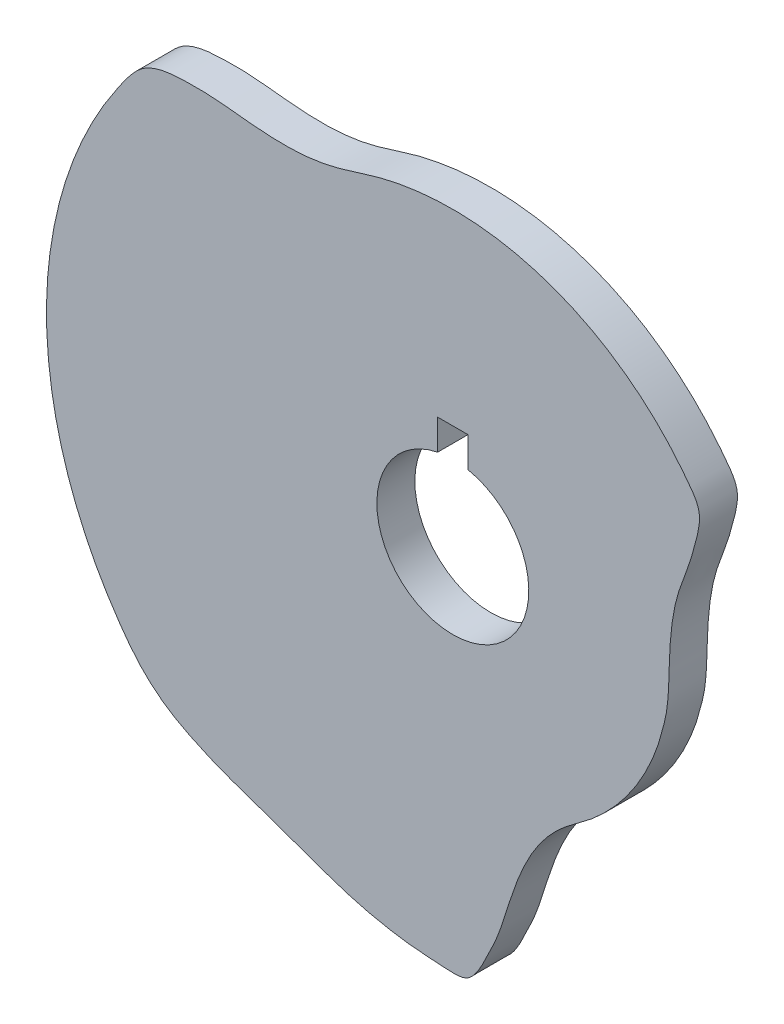
ISO-10303-21;
HEADER;
FILE_DESCRIPTION(('STEP AP214'),'2;1');
FILE_NAME('part.step','',(''),(''),'','','');
FILE_SCHEMA(('AUTOMOTIVE_DESIGN { 1 0 10303 214 1 1 1 1 }'));
ENDSEC;
DATA;
#1=APPLICATION_CONTEXT('core data for automotive mechanical design processes');
#2=APPLICATION_PROTOCOL_DEFINITION('international standard','automotive_design',2000,#1);
#3=PRODUCT_CONTEXT('',#1,'mechanical');
#4=PRODUCT('Part','Part','',(#3));
#5=PRODUCT_RELATED_PRODUCT_CATEGORY('part','',(#4));
#6=PRODUCT_DEFINITION_FORMATION('','',#4);
#7=PRODUCT_DEFINITION_CONTEXT('part definition',#1,'design');
#8=PRODUCT_DEFINITION('design','',#6,#7);
#9=PRODUCT_DEFINITION_SHAPE('','',#8);
#10=(LENGTH_UNIT() NAMED_UNIT(*) SI_UNIT(.MILLI.,.METRE.));
#11=(NAMED_UNIT(*) PLANE_ANGLE_UNIT() SI_UNIT($,.RADIAN.));
#12=(NAMED_UNIT(*) SI_UNIT($,.STERADIAN.) SOLID_ANGLE_UNIT());
#13=UNCERTAINTY_MEASURE_WITH_UNIT(LENGTH_MEASURE(1.E-05),#10,'distance_accuracy_value','');
#14=(GEOMETRIC_REPRESENTATION_CONTEXT(3) GLOBAL_UNCERTAINTY_ASSIGNED_CONTEXT((#13)) GLOBAL_UNIT_ASSIGNED_CONTEXT((#10,
#11,#12)) REPRESENTATION_CONTEXT('',''));
#15=CARTESIAN_POINT('',(0.,0.,0.));
#16=DIRECTION('',(0.,0.,1.));
#17=DIRECTION('',(1.,0.,0.));
#18=AXIS2_PLACEMENT_3D('',#15,#16,#17);
#19=CARTESIAN_POINT('',(0.,0.,0.));
#20=DIRECTION('',(0.,0.,-1.));
#21=DIRECTION('',(-1.,0.,0.));
#22=AXIS2_PLACEMENT_3D('',#19,#20,#21);
#23=PLANE('',#22);
#24=CARTESIAN_POINT('',(0.,0.,0.));
#25=DIRECTION('',(0.,0.,1.));
#26=DIRECTION('',(1.,0.,0.));
#27=AXIS2_PLACEMENT_3D('',#24,#25,#26);
#28=CIRCLE('',#27,20.);
#29=CARTESIAN_POINT('',(-4.,19.5959179422654,0.));
#30=VERTEX_POINT('',#29);
#31=CARTESIAN_POINT('',(4.,19.5959179422654,0.));
#32=VERTEX_POINT('',#31);
#33=EDGE_CURVE('E97',#30,#32,#28,.T.);
#34=ORIENTED_EDGE('',*,*,#33,.T.);
#35=DIRECTION('',(0.,1.,0.));
#36=VECTOR('',#35,1.);
#37=CARTESIAN_POINT('',(4.,27.5959179422654,0.));
#38=LINE('',#37,#36);
#39=CARTESIAN_POINT('',(4.,27.5959179422654,0.));
#40=VERTEX_POINT('',#39);
#41=EDGE_CURVE('E107',#32,#40,#38,.T.);
#42=ORIENTED_EDGE('',*,*,#41,.T.);
#43=DIRECTION('',(-1.,0.,0.));
#44=VECTOR('',#43,1.);
#45=CARTESIAN_POINT('',(-4.,27.5959179422654,0.));
#46=LINE('',#45,#44);
#47=CARTESIAN_POINT('',(-4.,27.5959179422654,0.));
#48=VERTEX_POINT('',#47);
#49=EDGE_CURVE('E69',#40,#48,#46,.T.);
#50=ORIENTED_EDGE('',*,*,#49,.T.);
#51=DIRECTION('',(0.,-1.,0.));
#52=VECTOR('',#51,1.);
#53=CARTESIAN_POINT('',(-4.,19.5959179422654,0.));
#54=LINE('',#53,#52);
#55=EDGE_CURVE('E104',#48,#30,#54,.T.);
#56=ORIENTED_EDGE('',*,*,#55,.T.);
#57=EDGE_LOOP('',(#34,#42,#50,#56));
#58=FACE_BOUND('',#57,.T.);
#59=CARTESIAN_POINT('',(56.932985488465,-0.000795580754406854,0.));
#60=CARTESIAN_POINT('',(57.1265117872127,6.5314537222661,0.));
#61=CARTESIAN_POINT('',(57.628936842633,16.0019031637885,0.));
#62=CARTESIAN_POINT('',(62.030801139415,26.1826523327394,0.));
#63=CARTESIAN_POINT('',(63.5942147590107,31.7068047744134,0.));
#64=CARTESIAN_POINT('',(64.7244718244501,35.9171577105034,0.));
#65=CARTESIAN_POINT('',(65.1715306906432,39.6107541113783,0.));
#66=CARTESIAN_POINT('',(64.2655833240798,42.3562944531799,0.));
#67=CARTESIAN_POINT('',(62.7177696465751,44.8445809892535,0.));
#68=CARTESIAN_POINT('',(60.0039032705138,48.2666530885387,0.));
#69=CARTESIAN_POINT('',(56.7652172552194,52.1574868930675,0.));
#70=CARTESIAN_POINT('',(52.6457166223139,56.2656658483215,0.));
#71=CARTESIAN_POINT('',(48.8371927938718,59.6202696103441,0.));
#72=CARTESIAN_POINT('',(44.2047377694369,63.1243277587699,0.));
#73=CARTESIAN_POINT('',(39.342870195165,66.2985395237317,0.));
#74=CARTESIAN_POINT('',(34.2255475391978,69.0475622426028,0.));
#75=CARTESIAN_POINT('',(28.9315251858536,71.4282271127832,0.));
#76=CARTESIAN_POINT('',(24.1605721111998,73.1797199037561,0.));
#77=CARTESIAN_POINT('',(18.5836604626458,74.7906106105405,0.));
#78=CARTESIAN_POINT('',(13.6136636120437,75.8533075455415,0.));
#79=CARTESIAN_POINT('',(7.86567619338137,76.6616905850528,0.));
#80=CARTESIAN_POINT('',(2.79490028297014,77.0161931006501,0.));
#81=CARTESIAN_POINT('',(-3.00810052431444,77.0017754221471,0.));
#82=CARTESIAN_POINT('',(-8.08183042843877,76.6506128610799,0.));
#83=CARTESIAN_POINT('',(-13.8173173184162,75.7932884332253,0.));
#84=CARTESIAN_POINT('',(-19.5184478852516,74.637220502732,0.));
#85=CARTESIAN_POINT('',(-26.3949902457872,72.318847925541,0.));
#86=CARTESIAN_POINT('',(-34.7729890539926,69.9223070386171,0.));
#87=CARTESIAN_POINT('',(-44.9838015657225,69.1987791316287,0.));
#88=CARTESIAN_POINT('',(-55.0870390824694,70.0786916735431,0.));
#89=CARTESIAN_POINT('',(-63.7521123051776,71.0890902886511,0.));
#90=CARTESIAN_POINT('',(-71.0025604038426,71.0071038532056,0.));
#91=CARTESIAN_POINT('',(-76.8229425776821,70.6195617458742,0.));
#92=CARTESIAN_POINT('',(-81.6102516241114,68.6438192062985,0.));
#93=CARTESIAN_POINT('',(-85.2050472965151,64.9904625074256,0.));
#94=CARTESIAN_POINT('',(-88.4828114308942,60.1897328777169,0.));
#95=CARTESIAN_POINT('',(-92.4413381074632,54.1182826377954,0.));
#96=CARTESIAN_POINT('',(-95.8635555363435,47.706986419514,0.));
#97=CARTESIAN_POINT('',(-99.1666038876376,40.4456158053087,0.));
#98=CARTESIAN_POINT('',(-101.67083906624,33.6280461914854,0.));
#99=CARTESIAN_POINT('',(-103.897432190414,25.9644593884122,0.));
#100=CARTESIAN_POINT('',(-105.415649913043,18.8641709560625,0.));
#101=CARTESIAN_POINT('',(-106.529042283645,10.9603642890687,0.));
#102=CARTESIAN_POINT('',(-107.026301872662,3.7174373137239,0.));
#103=CARTESIAN_POINT('',(-107.006094143672,-4.264828025162,0.));
#104=CARTESIAN_POINT('',(-106.471291558894,-11.5048712183218,0.));
#105=CARTESIAN_POINT('',(-105.318311750108,-19.4034780360237,0.));
#106=CARTESIAN_POINT('',(-103.762276659733,-26.4946784593138,0.));
#107=CARTESIAN_POINT('',(-101.499407274708,-34.1491778675688,0.));
#108=CARTESIAN_POINT('',(-98.9547131041179,-40.949146728792,0.));
#109=CARTESIAN_POINT('',(-95.6254769940491,-48.2026554947876,0.));
#110=CARTESIAN_POINT('',(-92.1484388189359,-54.578006394956,0.));
#111=CARTESIAN_POINT('',(-88.2028166580265,-60.6649016758483,0.));
#112=CARTESIAN_POINT('',(-84.383673705292,-65.9680486906177,0.));
#113=CARTESIAN_POINT('',(-79.956026115792,-70.7867073114572,0.));
#114=CARTESIAN_POINT('',(-74.7450756097247,-74.7706792280249,0.));
#115=CARTESIAN_POINT('',(-68.3491763549446,-78.2095859136178,0.));
#116=CARTESIAN_POINT('',(-61.700090236524,-81.1256631971354,0.));
#117=CARTESIAN_POINT('',(-54.1671376569417,-83.7633032765232,0.));
#118=CARTESIAN_POINT('',(-46.6246464080232,-86.3597264622415,0.));
#119=CARTESIAN_POINT('',(-38.4179019532647,-89.2690596867458,0.));
#120=CARTESIAN_POINT('',(-30.9321348248925,-92.0186188537581,0.));
#121=CARTESIAN_POINT('',(-23.9644549974314,-94.0880842501288,0.));
#122=CARTESIAN_POINT('',(-17.5921379517445,-95.4353648923242,0.));
#123=CARTESIAN_POINT('',(-11.1106765055818,-96.4958633006157,0.));
#124=CARTESIAN_POINT('',(-5.36506695402572,-96.7864859894993,0.));
#125=CARTESIAN_POINT('',(-0.2401939688309,-97.216006130729,0.));
#126=CARTESIAN_POINT('',(3.48152725490005,-97.0141722501915,0.));
#127=CARTESIAN_POINT('',(6.585949682994,-93.8819176237377,0.));
#128=CARTESIAN_POINT('',(8.86961266351349,-89.1721051747951,0.));
#129=CARTESIAN_POINT('',(12.0284425670296,-82.752455701177,0.));
#130=CARTESIAN_POINT('',(14.6079307279909,-74.3591082557124,0.));
#131=CARTESIAN_POINT('',(17.803889194673,-64.7575683881964,0.));
#132=CARTESIAN_POINT('',(22.7225338034349,-55.7585630029658,0.));
#133=CARTESIAN_POINT('',(28.7686732016411,-49.4111901166388,0.));
#134=CARTESIAN_POINT('',(34.1709124303925,-45.7136608546231,0.));
#135=CARTESIAN_POINT('',(38.0914855914377,-42.4881304721686,0.));
#136=CARTESIAN_POINT('',(41.2152414952405,-39.4494197497093,0.));
#137=CARTESIAN_POINT('',(44.1070014657475,-36.1942858828279,0.));
#138=CARTESIAN_POINT('',(46.737794890336,-32.7232692716914,0.));
#139=CARTESIAN_POINT('',(49.1002313365385,-29.0630605339127,0.));
#140=CARTESIAN_POINT('',(51.1682663388948,-25.2332461550136,0.));
#141=CARTESIAN_POINT('',(52.9536691475295,-21.2562132990754,0.));
#142=CARTESIAN_POINT('',(54.1800752040546,-17.8388748323473,0.));
#143=CARTESIAN_POINT('',(55.1237608704029,-14.3604886758475,0.));
#144=CARTESIAN_POINT('',(56.7416260422024,-8.69999774622029,0.));
#145=CARTESIAN_POINT('',(56.8254708780496,-3.62982297132136,0.));
#146=CARTESIAN_POINT('',(56.932985488465,-0.000795580754406854,0.));
#147=B_SPLINE_CURVE_WITH_KNOTS('',3,(#59,#60,#61,#62,#63,#64,#65,#66,#67,#68,#69,#70,#71,#72,
#73,#74,#75,#76,#77,#78,#79,#80,#81,#82,#83,#84,#85,#86,#87,#88,#89,#90,#91,#92,#93,#94,#95,#96,
#97,#98,#99,#100,#101,#102,#103,#104,#105,#106,#107,#108,#109,#110,#111,#112,#113,#114,#115,
#116,#117,#118,#119,#120,#121,#122,#123,#124,#125,#126,#127,#128,#129,#130,#131,#132,#133,#134,
#135,#136,#137,#138,#139,#140,#141,#142,#143,#144,#145,#146),.UNSPECIFIED.,.T.,.F.,(4,1,1,1,1,1,
1,1,1,1,1,1,1,1,1,1,1,1,1,1,1,1,1,1,1,1,1,1,1,1,1,1,1,1,1,1,1,1,1,1,1,1,1,1,1,1,1,1,1,1,1,1,1,1,
1,1,1,1,1,1,1,1,1,1,1,1,1,1,1,1,1,1,1,1,1,1,1,1,1,1,1,1,1,1,1,4),(0.,0.03515625,0.05078125,
0.05859375,0.06640625,0.07421875,0.078125,0.0820312499999948,0.08984375,0.1015625,0.109375,
0.12109375,0.12890625,0.140625,0.15234375,0.16015625,0.171875,0.1796875,0.19140625,0.19921875,
0.2109375,0.21875,0.23046875,0.23828125,0.249999999999999,0.261718750000002,0.27734375,
0.296874999999996,0.31640625,0.33203125,0.34375,0.35546875,0.363281249999999,0.37109375,
0.3828125,0.39453125,0.41015625,0.421875,0.4375,0.44921875,0.46484375,0.4765625,0.4921875,
0.50390625,0.51953125,0.53125,0.546875,0.55859375,0.57421875,0.5859375,0.60156249999999,
0.613281250000007,0.625,0.63671875,0.6484375,0.66015625,0.675781249999998,0.6875,0.703125,
0.71875,0.734375,0.74609375,0.757812500000002,0.76953125,0.781250000000001,0.7890625,0.796875,
0.800781249999999,0.812499999999998,0.824218750000008,0.83984375,0.859375,0.87890625,0.89453125,
0.906249999999974,0.9140625,0.921875,0.9296875,0.9375,0.9453125,0.953125,0.9609375,0.96875,
0.97265625,0.98046875,1.),.UNSPECIFIED.);
#148=CARTESIAN_POINT('',(56.932985488465,-0.000795580754406854,0.));
#149=VERTEX_POINT('',#148);
#150=EDGE_CURVE('E62',#149,#149,#147,.T.);
#151=ORIENTED_EDGE('',*,*,#150,.F.);
#152=EDGE_LOOP('',(#151));
#153=FACE_BOUND('',#152,.T.);
#154=ADVANCED_FACE('F52',(#58,#153),#23,.T.);
#155=CARTESIAN_POINT('',(0.,0.,10.));
#156=DIRECTION('',(0.,0.,-1.));
#157=DIRECTION('',(-1.,0.,0.));
#158=AXIS2_PLACEMENT_3D('',#155,#156,#157);
#159=PLANE('',#158);
#160=DIRECTION('',(0.,1.,0.));
#161=VECTOR('',#160,1.);
#162=CARTESIAN_POINT('',(4.,27.5959179422654,10.));
#163=LINE('',#162,#161);
#164=CARTESIAN_POINT('',(4.,19.5959179422654,10.));
#165=VERTEX_POINT('',#164);
#166=CARTESIAN_POINT('',(4.,27.5959179422654,10.));
#167=VERTEX_POINT('',#166);
#168=EDGE_CURVE('E128',#165,#167,#163,.T.);
#169=ORIENTED_EDGE('',*,*,#168,.F.);
#170=CARTESIAN_POINT('',(0.,0.,10.));
#171=DIRECTION('',(0.,0.,1.));
#172=DIRECTION('',(1.,0.,0.));
#173=AXIS2_PLACEMENT_3D('',#170,#171,#172);
#174=CIRCLE('',#173,20.);
#175=CARTESIAN_POINT('',(-4.,19.5959179422654,10.));
#176=VERTEX_POINT('',#175);
#177=EDGE_CURVE('E77',#176,#165,#174,.T.);
#178=ORIENTED_EDGE('',*,*,#177,.F.);
#179=DIRECTION('',(0.,-1.,0.));
#180=VECTOR('',#179,1.);
#181=CARTESIAN_POINT('',(-4.,19.5959179422654,10.));
#182=LINE('',#181,#180);
#183=CARTESIAN_POINT('',(-4.,27.5959179422654,10.));
#184=VERTEX_POINT('',#183);
#185=EDGE_CURVE('E115',#184,#176,#182,.T.);
#186=ORIENTED_EDGE('',*,*,#185,.F.);
#187=DIRECTION('',(-1.,0.,0.));
#188=VECTOR('',#187,1.);
#189=CARTESIAN_POINT('',(-4.,27.5959179422654,10.));
#190=LINE('',#189,#188);
#191=EDGE_CURVE('E119',#167,#184,#190,.T.);
#192=ORIENTED_EDGE('',*,*,#191,.F.);
#193=EDGE_LOOP('',(#169,#178,#186,#192));
#194=FACE_BOUND('',#193,.T.);
#195=CARTESIAN_POINT('',(56.932985488465,-0.000795580754406854,10.));
#196=CARTESIAN_POINT('',(57.1265117872127,6.5314537222661,10.));
#197=CARTESIAN_POINT('',(57.628936842633,16.0019031637885,10.));
#198=CARTESIAN_POINT('',(62.030801139415,26.1826523327394,10.));
#199=CARTESIAN_POINT('',(63.5942147590107,31.7068047744134,10.));
#200=CARTESIAN_POINT('',(64.7244718244501,35.9171577105034,10.));
#201=CARTESIAN_POINT('',(65.1715306906432,39.6107541113783,10.));
#202=CARTESIAN_POINT('',(64.2655833240798,42.3562944531799,10.));
#203=CARTESIAN_POINT('',(62.7177696465751,44.8445809892535,10.));
#204=CARTESIAN_POINT('',(60.0039032705138,48.2666530885387,10.));
#205=CARTESIAN_POINT('',(56.7652172552194,52.1574868930675,10.));
#206=CARTESIAN_POINT('',(52.6457166223139,56.2656658483215,10.));
#207=CARTESIAN_POINT('',(48.8371927938718,59.6202696103441,10.));
#208=CARTESIAN_POINT('',(44.2047377694369,63.1243277587699,10.));
#209=CARTESIAN_POINT('',(39.342870195165,66.2985395237317,10.));
#210=CARTESIAN_POINT('',(34.2255475391978,69.0475622426028,10.));
#211=CARTESIAN_POINT('',(28.9315251858536,71.4282271127832,10.));
#212=CARTESIAN_POINT('',(24.1605721111998,73.1797199037561,10.));
#213=CARTESIAN_POINT('',(18.5836604626458,74.7906106105405,10.));
#214=CARTESIAN_POINT('',(13.6136636120437,75.8533075455415,10.));
#215=CARTESIAN_POINT('',(7.86567619338137,76.6616905850528,10.));
#216=CARTESIAN_POINT('',(2.79490028297014,77.0161931006501,10.));
#217=CARTESIAN_POINT('',(-3.00810052431444,77.0017754221471,10.));
#218=CARTESIAN_POINT('',(-8.08183042843877,76.6506128610799,10.));
#219=CARTESIAN_POINT('',(-13.8173173184162,75.7932884332253,10.));
#220=CARTESIAN_POINT('',(-19.5184478852516,74.637220502732,10.));
#221=CARTESIAN_POINT('',(-26.3949902457872,72.318847925541,10.));
#222=CARTESIAN_POINT('',(-34.7729890539926,69.9223070386171,10.));
#223=CARTESIAN_POINT('',(-44.9838015657225,69.1987791316287,10.));
#224=CARTESIAN_POINT('',(-55.0870390824694,70.0786916735431,10.));
#225=CARTESIAN_POINT('',(-63.7521123051776,71.0890902886511,10.));
#226=CARTESIAN_POINT('',(-71.0025604038426,71.0071038532056,10.));
#227=CARTESIAN_POINT('',(-76.8229425776821,70.6195617458742,10.));
#228=CARTESIAN_POINT('',(-81.6102516241114,68.6438192062985,10.));
#229=CARTESIAN_POINT('',(-85.2050472965151,64.9904625074256,10.));
#230=CARTESIAN_POINT('',(-88.4828114308942,60.1897328777169,10.));
#231=CARTESIAN_POINT('',(-92.4413381074632,54.1182826377954,10.));
#232=CARTESIAN_POINT('',(-95.8635555363435,47.706986419514,10.));
#233=CARTESIAN_POINT('',(-99.1666038876376,40.4456158053087,10.));
#234=CARTESIAN_POINT('',(-101.67083906624,33.6280461914854,10.));
#235=CARTESIAN_POINT('',(-103.897432190414,25.9644593884122,10.));
#236=CARTESIAN_POINT('',(-105.415649913043,18.8641709560625,10.));
#237=CARTESIAN_POINT('',(-106.529042283645,10.9603642890687,10.));
#238=CARTESIAN_POINT('',(-107.026301872662,3.7174373137239,10.));
#239=CARTESIAN_POINT('',(-107.006094143672,-4.264828025162,10.));
#240=CARTESIAN_POINT('',(-106.471291558894,-11.5048712183218,10.));
#241=CARTESIAN_POINT('',(-105.318311750108,-19.4034780360237,10.));
#242=CARTESIAN_POINT('',(-103.762276659733,-26.4946784593138,10.));
#243=CARTESIAN_POINT('',(-101.499407274708,-34.1491778675688,10.));
#244=CARTESIAN_POINT('',(-98.9547131041179,-40.949146728792,10.));
#245=CARTESIAN_POINT('',(-95.6254769940491,-48.2026554947876,10.));
#246=CARTESIAN_POINT('',(-92.1484388189359,-54.578006394956,10.));
#247=CARTESIAN_POINT('',(-88.2028166580265,-60.6649016758483,10.));
#248=CARTESIAN_POINT('',(-84.383673705292,-65.9680486906177,10.));
#249=CARTESIAN_POINT('',(-79.956026115792,-70.7867073114572,10.));
#250=CARTESIAN_POINT('',(-74.7450756097247,-74.7706792280249,10.));
#251=CARTESIAN_POINT('',(-68.3491763549446,-78.2095859136178,10.));
#252=CARTESIAN_POINT('',(-61.700090236524,-81.1256631971354,10.));
#253=CARTESIAN_POINT('',(-54.1671376569417,-83.7633032765232,10.));
#254=CARTESIAN_POINT('',(-46.6246464080232,-86.3597264622415,10.));
#255=CARTESIAN_POINT('',(-38.4179019532647,-89.2690596867458,10.));
#256=CARTESIAN_POINT('',(-30.9321348248925,-92.0186188537581,10.));
#257=CARTESIAN_POINT('',(-23.9644549974314,-94.0880842501288,10.));
#258=CARTESIAN_POINT('',(-17.5921379517445,-95.4353648923242,10.));
#259=CARTESIAN_POINT('',(-11.1106765055818,-96.4958633006157,10.));
#260=CARTESIAN_POINT('',(-5.36506695402572,-96.7864859894993,10.));
#261=CARTESIAN_POINT('',(-0.2401939688309,-97.216006130729,10.));
#262=CARTESIAN_POINT('',(3.48152725490005,-97.0141722501915,10.));
#263=CARTESIAN_POINT('',(6.585949682994,-93.8819176237377,10.));
#264=CARTESIAN_POINT('',(8.86961266351349,-89.1721051747951,10.));
#265=CARTESIAN_POINT('',(12.0284425670296,-82.752455701177,10.));
#266=CARTESIAN_POINT('',(14.6079307279909,-74.3591082557124,10.));
#267=CARTESIAN_POINT('',(17.803889194673,-64.7575683881964,10.));
#268=CARTESIAN_POINT('',(22.7225338034349,-55.7585630029658,10.));
#269=CARTESIAN_POINT('',(28.7686732016411,-49.4111901166388,10.));
#270=CARTESIAN_POINT('',(34.1709124303925,-45.7136608546231,10.));
#271=CARTESIAN_POINT('',(38.0914855914377,-42.4881304721686,10.));
#272=CARTESIAN_POINT('',(41.2152414952405,-39.4494197497093,10.));
#273=CARTESIAN_POINT('',(44.1070014657475,-36.1942858828279,10.));
#274=CARTESIAN_POINT('',(46.737794890336,-32.7232692716914,10.));
#275=CARTESIAN_POINT('',(49.1002313365385,-29.0630605339127,10.));
#276=CARTESIAN_POINT('',(51.1682663388948,-25.2332461550136,10.));
#277=CARTESIAN_POINT('',(52.9536691475295,-21.2562132990754,10.));
#278=CARTESIAN_POINT('',(54.1800752040546,-17.8388748323473,10.));
#279=CARTESIAN_POINT('',(55.1237608704029,-14.3604886758475,10.));
#280=CARTESIAN_POINT('',(56.7416260422024,-8.69999774622029,10.));
#281=CARTESIAN_POINT('',(56.8254708780496,-3.62982297132136,10.));
#282=CARTESIAN_POINT('',(56.932985488465,-0.000795580754406854,10.));
#283=B_SPLINE_CURVE_WITH_KNOTS('',3,(#195,#196,#197,#198,#199,#200,#201,#202,#203,#204,#205,
#206,#207,#208,#209,#210,#211,#212,#213,#214,#215,#216,#217,#218,#219,#220,#221,#222,#223,#224,
#225,#226,#227,#228,#229,#230,#231,#232,#233,#234,#235,#236,#237,#238,#239,#240,#241,#242,#243,
#244,#245,#246,#247,#248,#249,#250,#251,#252,#253,#254,#255,#256,#257,#258,#259,#260,#261,#262,
#263,#264,#265,#266,#267,#268,#269,#270,#271,#272,#273,#274,#275,#276,#277,#278,#279,#280,#281,
#282),.UNSPECIFIED.,.T.,.F.,(4,1,1,1,1,1,1,1,1,1,1,1,1,1,1,1,1,1,1,1,1,1,1,1,1,1,1,1,1,1,1,1,1,
1,1,1,1,1,1,1,1,1,1,1,1,1,1,1,1,1,1,1,1,1,1,1,1,1,1,1,1,1,1,1,1,1,1,1,1,1,1,1,1,1,1,1,1,1,1,1,1,
1,1,1,1,4),(0.,0.03515625,0.05078125,0.05859375,0.06640625,0.07421875,0.078125,
0.0820312499999948,0.08984375,0.1015625,0.109375,0.12109375,0.12890625,0.140625,0.15234375,
0.16015625,0.171875,0.1796875,0.19140625,0.19921875,0.2109375,0.21875,0.23046875,0.23828125,
0.249999999999999,0.261718750000002,0.27734375,0.296874999999996,0.31640625,0.33203125,0.34375,
0.35546875,0.363281249999999,0.37109375,0.3828125,0.39453125,0.41015625,0.421875,0.4375,
0.44921875,0.46484375,0.4765625,0.4921875,0.50390625,0.51953125,0.53125,0.546875,0.55859375,
0.57421875,0.5859375,0.60156249999999,0.613281250000007,0.625,0.63671875,0.6484375,0.66015625,
0.675781249999998,0.6875,0.703125,0.71875,0.734375,0.74609375,0.757812500000002,0.76953125,
0.781250000000001,0.7890625,0.796875,0.800781249999999,0.812499999999998,0.824218750000008,
0.83984375,0.859375,0.87890625,0.89453125,0.906249999999974,0.9140625,0.921875,0.9296875,0.9375,
0.9453125,0.953125,0.9609375,0.96875,0.97265625,0.98046875,1.),.UNSPECIFIED.);
#284=CARTESIAN_POINT('',(56.932985488465,-0.000795580754406854,10.));
#285=VERTEX_POINT('',#284);
#286=EDGE_CURVE('E12',#285,#285,#283,.T.);
#287=ORIENTED_EDGE('',*,*,#286,.T.);
#288=EDGE_LOOP('',(#287));
#289=FACE_BOUND('',#288,.T.);
#290=ADVANCED_FACE('F153',(#194,#289),#159,.F.);
#291=DIRECTION('',(0.,0.,1.));
#292=VECTOR('',#291,1.);
#293=SURFACE_OF_LINEAR_EXTRUSION('',#147,#292);
#294=ORIENTED_EDGE('',*,*,#150,.T.);
#295=EDGE_LOOP('',(#294));
#296=FACE_BOUND('',#295,.T.);
#297=ORIENTED_EDGE('',*,*,#286,.F.);
#298=EDGE_LOOP('',(#297));
#299=FACE_BOUND('',#298,.T.);
#300=ADVANCED_FACE('F150',(#296,#299),#293,.T.);
#301=CARTESIAN_POINT('',(0.,0.,0.));
#302=DIRECTION('',(0.,0.,1.));
#303=DIRECTION('',(1.,0.,0.));
#304=AXIS2_PLACEMENT_3D('',#301,#302,#303);
#305=CYLINDRICAL_SURFACE('',#304,20.);
#306=ORIENTED_EDGE('',*,*,#177,.T.);
#307=DIRECTION('',(0.,0.,1.));
#308=VECTOR('',#307,1.);
#309=CARTESIAN_POINT('',(4.,19.5959179422654,0.));
#310=LINE('',#309,#308);
#311=EDGE_CURVE('E93',#32,#165,#310,.T.);
#312=ORIENTED_EDGE('',*,*,#311,.F.);
#313=ORIENTED_EDGE('',*,*,#33,.F.);
#314=DIRECTION('',(0.,0.,1.));
#315=VECTOR('',#314,1.);
#316=CARTESIAN_POINT('',(-4.,19.5959179422654,0.));
#317=LINE('',#316,#315);
#318=EDGE_CURVE('E134',#30,#176,#317,.T.);
#319=ORIENTED_EDGE('',*,*,#318,.T.);
#320=EDGE_LOOP('',(#306,#312,#313,#319));
#321=FACE_BOUND('',#320,.T.);
#322=ADVANCED_FACE('F95',(#321),#305,.F.);
#323=CARTESIAN_POINT('',(-4.,19.5959179422654,0.));
#324=DIRECTION('',(-1.,0.,0.));
#325=DIRECTION('',(0.,0.,1.));
#326=AXIS2_PLACEMENT_3D('',#323,#324,#325);
#327=PLANE('',#326);
#328=ORIENTED_EDGE('',*,*,#185,.T.);
#329=ORIENTED_EDGE('',*,*,#318,.F.);
#330=ORIENTED_EDGE('',*,*,#55,.F.);
#331=DIRECTION('',(0.,0.,1.));
#332=VECTOR('',#331,1.);
#333=CARTESIAN_POINT('',(-4.,27.5959179422654,0.));
#334=LINE('',#333,#332);
#335=EDGE_CURVE('E137',#48,#184,#334,.T.);
#336=ORIENTED_EDGE('',*,*,#335,.T.);
#337=EDGE_LOOP('',(#328,#329,#330,#336));
#338=FACE_BOUND('',#337,.T.);
#339=ADVANCED_FACE('F168',(#338),#327,.F.);
#340=CARTESIAN_POINT('',(-4.,27.5959179422654,0.));
#341=DIRECTION('',(0.,1.,0.));
#342=DIRECTION('',(0.,0.,1.));
#343=AXIS2_PLACEMENT_3D('',#340,#341,#342);
#344=PLANE('',#343);
#345=ORIENTED_EDGE('',*,*,#191,.T.);
#346=ORIENTED_EDGE('',*,*,#335,.F.);
#347=ORIENTED_EDGE('',*,*,#49,.F.);
#348=DIRECTION('',(0.,0.,1.));
#349=VECTOR('',#348,1.);
#350=CARTESIAN_POINT('',(4.,27.5959179422654,0.));
#351=LINE('',#350,#349);
#352=EDGE_CURVE('E103',#40,#167,#351,.T.);
#353=ORIENTED_EDGE('',*,*,#352,.T.);
#354=EDGE_LOOP('',(#345,#346,#347,#353));
#355=FACE_BOUND('',#354,.T.);
#356=ADVANCED_FACE('F166',(#355),#344,.F.);
#357=CARTESIAN_POINT('',(4.,27.5959179422654,0.));
#358=DIRECTION('',(1.,0.,0.));
#359=DIRECTION('',(0.,0.,-1.));
#360=AXIS2_PLACEMENT_3D('',#357,#358,#359);
#361=PLANE('',#360);
#362=ORIENTED_EDGE('',*,*,#168,.T.);
#363=ORIENTED_EDGE('',*,*,#352,.F.);
#364=ORIENTED_EDGE('',*,*,#41,.F.);
#365=ORIENTED_EDGE('',*,*,#311,.T.);
#366=EDGE_LOOP('',(#362,#363,#364,#365));
#367=FACE_BOUND('',#366,.T.);
#368=ADVANCED_FACE('F108',(#367),#361,.F.);
#369=CLOSED_SHELL('',(#154,#290,#300,#322,#339,#356,#368));
#370=MANIFOLD_SOLID_BREP('B2',#369);
#371=ADVANCED_BREP_SHAPE_REPRESENTATION('',(#18,#370),#14);
#372=SHAPE_DEFINITION_REPRESENTATION(#9,#371);
ENDSEC;
END-ISO-10303-21;
